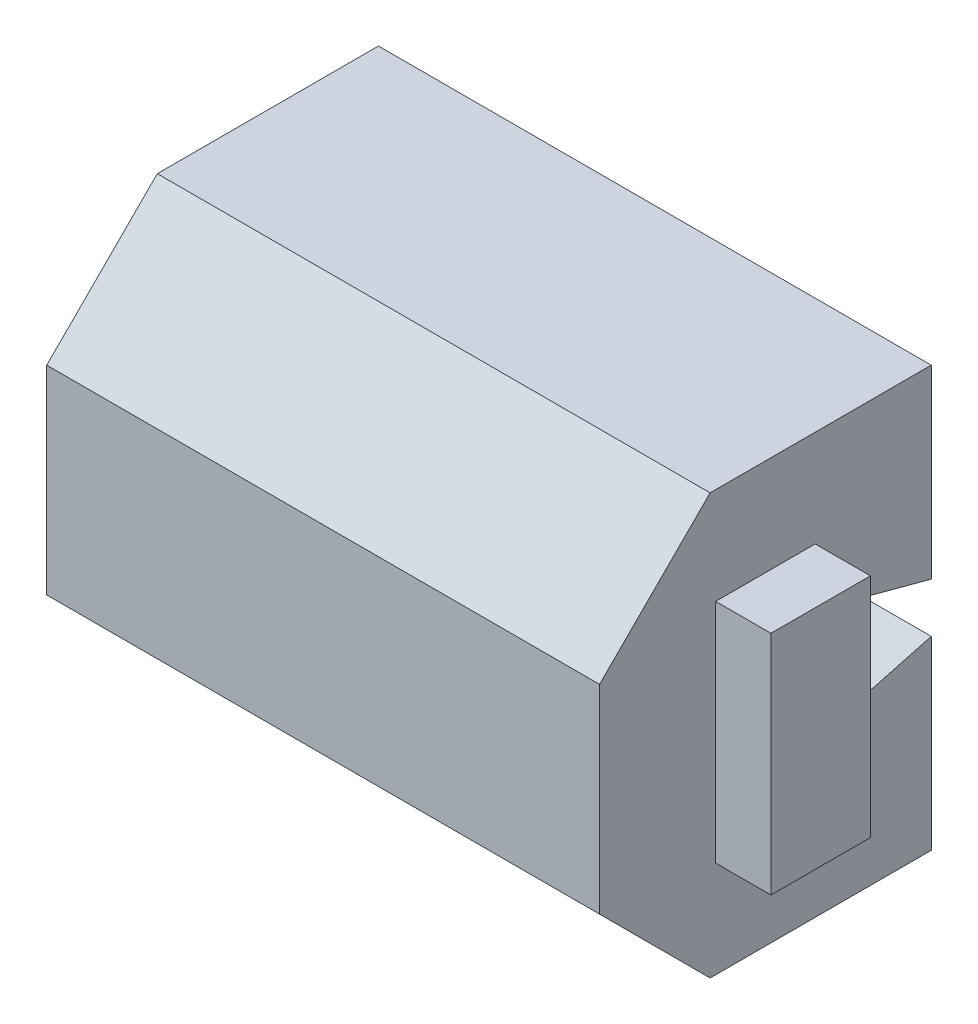
ISO-10303-21;
HEADER;
FILE_DESCRIPTION(('STEP AP214'),'2;1');
FILE_NAME('part.step','',(''),(''),'','','');
FILE_SCHEMA(('AUTOMOTIVE_DESIGN { 1 0 10303 214 1 1 1 1 }'));
ENDSEC;
DATA;
#1=APPLICATION_CONTEXT('core data for automotive mechanical design processes');
#2=APPLICATION_PROTOCOL_DEFINITION('international standard','automotive_design',2000,#1);
#3=PRODUCT_CONTEXT('',#1,'mechanical');
#4=PRODUCT('Part','Part','',(#3));
#5=PRODUCT_RELATED_PRODUCT_CATEGORY('part','',(#4));
#6=PRODUCT_DEFINITION_FORMATION('','',#4);
#7=PRODUCT_DEFINITION_CONTEXT('part definition',#1,'design');
#8=PRODUCT_DEFINITION('design','',#6,#7);
#9=PRODUCT_DEFINITION_SHAPE('','',#8);
#10=(LENGTH_UNIT() NAMED_UNIT(*) SI_UNIT(.MILLI.,.METRE.));
#11=(NAMED_UNIT(*) PLANE_ANGLE_UNIT() SI_UNIT($,.RADIAN.));
#12=(NAMED_UNIT(*) SI_UNIT($,.STERADIAN.) SOLID_ANGLE_UNIT());
#13=UNCERTAINTY_MEASURE_WITH_UNIT(LENGTH_MEASURE(1.E-05),#10,'distance_accuracy_value','');
#14=(GEOMETRIC_REPRESENTATION_CONTEXT(3) GLOBAL_UNCERTAINTY_ASSIGNED_CONTEXT((#13)) GLOBAL_UNIT_ASSIGNED_CONTEXT((#10,
#11,#12)) REPRESENTATION_CONTEXT('',''));
#15=CARTESIAN_POINT('',(0.,0.,0.));
#16=DIRECTION('',(0.,0.,1.));
#17=DIRECTION('',(1.,0.,0.));
#18=AXIS2_PLACEMENT_3D('',#15,#16,#17);
#19=CARTESIAN_POINT('',(-50.,19.,-15.));
#20=DIRECTION('',(0.,0.,1.));
#21=DIRECTION('',(1.,0.,0.));
#22=AXIS2_PLACEMENT_3D('',#19,#20,#21);
#23=PLANE('',#22);
#24=DIRECTION('',(0.,-1.,0.));
#25=VECTOR('',#24,1.);
#26=CARTESIAN_POINT('',(0.,19.,-15.));
#27=LINE('',#26,#25);
#28=CARTESIAN_POINT('',(0.,19.,-15.));
#29=VERTEX_POINT('',#28);
#30=CARTESIAN_POINT('',(0.,2.24038105676654,-15.));
#31=VERTEX_POINT('',#30);
#32=EDGE_CURVE('E208',#29,#31,#27,.T.);
#33=ORIENTED_EDGE('',*,*,#32,.T.);
#34=DIRECTION('',(-1.,0.,0.));
#35=VECTOR('',#34,1.);
#36=CARTESIAN_POINT('',(5.,2.24038105676654,-15.));
#37=LINE('',#36,#35);
#38=CARTESIAN_POINT('',(-50.,2.24038105676654,-15.));
#39=VERTEX_POINT('',#38);
#40=EDGE_CURVE('E181',#31,#39,#37,.T.);
#41=ORIENTED_EDGE('',*,*,#40,.T.);
#42=DIRECTION('',(0.,-1.,0.));
#43=VECTOR('',#42,1.);
#44=CARTESIAN_POINT('',(-50.,19.,-15.));
#45=LINE('',#44,#43);
#46=CARTESIAN_POINT('',(-50.,19.,-15.));
#47=VERTEX_POINT('',#46);
#48=EDGE_CURVE('E215',#47,#39,#45,.T.);
#49=ORIENTED_EDGE('',*,*,#48,.F.);
#50=DIRECTION('',(1.,0.,0.));
#51=VECTOR('',#50,1.);
#52=CARTESIAN_POINT('',(-50.,19.,-15.));
#53=LINE('',#52,#51);
#54=EDGE_CURVE('E235',#47,#29,#53,.T.);
#55=ORIENTED_EDGE('',*,*,#54,.T.);
#56=EDGE_LOOP('',(#33,#41,#49,#55));
#57=FACE_BOUND('',#56,.T.);
#58=ADVANCED_FACE('F47',(#57),#23,.F.);
#59=CARTESIAN_POINT('',(5.,10.25,-4.5));
#60=DIRECTION('',(0.,-1.,0.));
#61=DIRECTION('',(0.,0.,-1.));
#62=AXIS2_PLACEMENT_3D('',#59,#60,#61);
#63=PLANE('',#62);
#64=DIRECTION('',(0.,0.,1.));
#65=VECTOR('',#64,1.);
#66=CARTESIAN_POINT('',(0.,10.25,-4.5));
#67=LINE('',#66,#65);
#68=CARTESIAN_POINT('',(0.,10.25,-4.5));
#69=VERTEX_POINT('',#68);
#70=CARTESIAN_POINT('',(0.,10.25,4.5));
#71=VERTEX_POINT('',#70);
#72=EDGE_CURVE('E239',#69,#71,#67,.T.);
#73=ORIENTED_EDGE('',*,*,#72,.T.);
#74=DIRECTION('',(-1.,0.,0.));
#75=VECTOR('',#74,1.);
#76=CARTESIAN_POINT('',(5.,10.25,4.5));
#77=LINE('',#76,#75);
#78=CARTESIAN_POINT('',(5.,10.25,4.5));
#79=VERTEX_POINT('',#78);
#80=EDGE_CURVE('E280',#79,#71,#77,.T.);
#81=ORIENTED_EDGE('',*,*,#80,.F.);
#82=DIRECTION('',(0.,0.,1.));
#83=VECTOR('',#82,1.);
#84=CARTESIAN_POINT('',(5.,10.25,-4.5));
#85=LINE('',#84,#83);
#86=CARTESIAN_POINT('',(5.,10.25,-4.5));
#87=VERTEX_POINT('',#86);
#88=EDGE_CURVE('E240',#87,#79,#85,.T.);
#89=ORIENTED_EDGE('',*,*,#88,.F.);
#90=DIRECTION('',(-1.,0.,0.));
#91=VECTOR('',#90,1.);
#92=CARTESIAN_POINT('',(5.,10.25,-4.5));
#93=LINE('',#92,#91);
#94=EDGE_CURVE('E254',#87,#69,#93,.T.);
#95=ORIENTED_EDGE('',*,*,#94,.T.);
#96=EDGE_LOOP('',(#73,#81,#89,#95));
#97=FACE_BOUND('',#96,.T.);
#98=ADVANCED_FACE('F349',(#97),#63,.F.);
#99=CARTESIAN_POINT('',(5.,-10.25,4.5));
#100=DIRECTION('',(0.,0.,-1.));
#101=DIRECTION('',(-1.,0.,0.));
#102=AXIS2_PLACEMENT_3D('',#99,#100,#101);
#103=PLANE('',#102);
#104=DIRECTION('',(0.,-1.,0.));
#105=VECTOR('',#104,1.);
#106=CARTESIAN_POINT('',(0.,-10.25,4.5));
#107=LINE('',#106,#105);
#108=CARTESIAN_POINT('',(0.,-10.25,4.5));
#109=VERTEX_POINT('',#108);
#110=EDGE_CURVE('E258',#71,#109,#107,.T.);
#111=ORIENTED_EDGE('',*,*,#110,.T.);
#112=DIRECTION('',(-1.,0.,0.));
#113=VECTOR('',#112,1.);
#114=CARTESIAN_POINT('',(5.,-10.25,4.5));
#115=LINE('',#114,#113);
#116=CARTESIAN_POINT('',(5.,-10.25,4.5));
#117=VERTEX_POINT('',#116);
#118=EDGE_CURVE('E276',#117,#109,#115,.T.);
#119=ORIENTED_EDGE('',*,*,#118,.F.);
#120=DIRECTION('',(0.,-1.,0.));
#121=VECTOR('',#120,1.);
#122=CARTESIAN_POINT('',(5.,-10.25,4.5));
#123=LINE('',#122,#121);
#124=EDGE_CURVE('E244',#79,#117,#123,.T.);
#125=ORIENTED_EDGE('',*,*,#124,.F.);
#126=ORIENTED_EDGE('',*,*,#80,.T.);
#127=EDGE_LOOP('',(#111,#119,#125,#126));
#128=FACE_BOUND('',#127,.T.);
#129=ADVANCED_FACE('F356',(#128),#103,.F.);
#130=CARTESIAN_POINT('',(5.,-10.25,-4.5));
#131=DIRECTION('',(0.,1.,0.));
#132=DIRECTION('',(0.,0.,1.));
#133=AXIS2_PLACEMENT_3D('',#130,#131,#132);
#134=PLANE('',#133);
#135=DIRECTION('',(0.,0.,-1.));
#136=VECTOR('',#135,1.);
#137=CARTESIAN_POINT('',(0.,-10.25,-4.5));
#138=LINE('',#137,#136);
#139=CARTESIAN_POINT('',(0.,-10.25,-4.5));
#140=VERTEX_POINT('',#139);
#141=EDGE_CURVE('E262',#109,#140,#138,.T.);
#142=ORIENTED_EDGE('',*,*,#141,.T.);
#143=DIRECTION('',(-1.,0.,0.));
#144=VECTOR('',#143,1.);
#145=CARTESIAN_POINT('',(5.,-10.25,-4.5));
#146=LINE('',#145,#144);
#147=CARTESIAN_POINT('',(5.,-10.25,-4.5));
#148=VERTEX_POINT('',#147);
#149=EDGE_CURVE('E272',#148,#140,#146,.T.);
#150=ORIENTED_EDGE('',*,*,#149,.F.);
#151=DIRECTION('',(0.,0.,-1.));
#152=VECTOR('',#151,1.);
#153=CARTESIAN_POINT('',(5.,-10.25,-4.5));
#154=LINE('',#153,#152);
#155=EDGE_CURVE('E248',#117,#148,#154,.T.);
#156=ORIENTED_EDGE('',*,*,#155,.F.);
#157=ORIENTED_EDGE('',*,*,#118,.T.);
#158=EDGE_LOOP('',(#142,#150,#156,#157));
#159=FACE_BOUND('',#158,.T.);
#160=ADVANCED_FACE('F381',(#159),#134,.F.);
#161=CARTESIAN_POINT('',(5.,-10.25,-4.5));
#162=DIRECTION('',(0.,0.,1.));
#163=DIRECTION('',(1.,0.,0.));
#164=AXIS2_PLACEMENT_3D('',#161,#162,#163);
#165=PLANE('',#164);
#166=DIRECTION('',(0.,1.,0.));
#167=VECTOR('',#166,1.);
#168=CARTESIAN_POINT('',(0.,-10.25,-4.5));
#169=LINE('',#168,#167);
#170=EDGE_CURVE('E245',#140,#69,#169,.T.);
#171=ORIENTED_EDGE('',*,*,#170,.T.);
#172=ORIENTED_EDGE('',*,*,#94,.F.);
#173=DIRECTION('',(0.,1.,0.));
#174=VECTOR('',#173,1.);
#175=CARTESIAN_POINT('',(5.,-10.25,-4.5));
#176=LINE('',#175,#174);
#177=EDGE_CURVE('E251',#148,#87,#176,.T.);
#178=ORIENTED_EDGE('',*,*,#177,.F.);
#179=ORIENTED_EDGE('',*,*,#149,.T.);
#180=EDGE_LOOP('',(#171,#172,#178,#179));
#181=FACE_BOUND('',#180,.T.);
#182=ADVANCED_FACE('F378',(#181),#165,.F.);
#183=CARTESIAN_POINT('',(5.,0.,0.));
#184=DIRECTION('',(-1.,0.,0.));
#185=DIRECTION('',(0.,0.,1.));
#186=AXIS2_PLACEMENT_3D('',#183,#184,#185);
#187=PLANE('',#186);
#188=ORIENTED_EDGE('',*,*,#88,.T.);
#189=ORIENTED_EDGE('',*,*,#124,.T.);
#190=ORIENTED_EDGE('',*,*,#155,.T.);
#191=ORIENTED_EDGE('',*,*,#177,.T.);
#192=EDGE_LOOP('',(#188,#189,#190,#191));
#193=FACE_BOUND('',#192,.T.);
#194=ADVANCED_FACE('F375',(#193),#187,.F.);
#195=CARTESIAN_POINT('',(0.,0.,0.));
#196=DIRECTION('',(1.,0.,0.));
#197=DIRECTION('',(0.,0.,-1.));
#198=AXIS2_PLACEMENT_3D('',#195,#196,#197);
#199=PLANE('',#198);
#200=DIRECTION('',(0.,0.,-1.));
#201=VECTOR('',#200,1.);
#202=CARTESIAN_POINT('',(0.,19.,-15.));
#203=LINE('',#202,#201);
#204=CARTESIAN_POINT('',(0.,19.,5.00000000000001));
#205=VERTEX_POINT('',#204);
#206=EDGE_CURVE('E225',#205,#29,#203,.T.);
#207=ORIENTED_EDGE('',*,*,#206,.F.);
#208=DIRECTION('',(0.,0.707106781186549,-0.707106781186546));
#209=VECTOR('',#208,1.);
#210=CARTESIAN_POINT('',(0.,12.,12.));
#211=LINE('',#210,#209);
#212=CARTESIAN_POINT('',(0.,8.99999999999998,15.));
#213=VERTEX_POINT('',#212);
#214=EDGE_CURVE('E291',#205,#213,#211,.F.);
#215=ORIENTED_EDGE('',*,*,#214,.T.);
#216=DIRECTION('',(0.,1.,0.));
#217=VECTOR('',#216,1.);
#218=CARTESIAN_POINT('',(0.,19.,15.));
#219=LINE('',#218,#217);
#220=CARTESIAN_POINT('',(0.,-9.,15.));
#221=VERTEX_POINT('',#220);
#222=EDGE_CURVE('E222',#221,#213,#219,.T.);
#223=ORIENTED_EDGE('',*,*,#222,.F.);
#224=DIRECTION('',(0.,0.707106781186546,0.707106781186549));
#225=VECTOR('',#224,1.);
#226=CARTESIAN_POINT('',(0.,-12.,12.));
#227=LINE('',#226,#225);
#228=CARTESIAN_POINT('',(0.,-19.,4.99999999999996));
#229=VERTEX_POINT('',#228);
#230=EDGE_CURVE('E288',#221,#229,#227,.F.);
#231=ORIENTED_EDGE('',*,*,#230,.T.);
#232=DIRECTION('',(0.,0.,1.));
#233=VECTOR('',#232,1.);
#234=CARTESIAN_POINT('',(0.,-19.,-15.));
#235=LINE('',#234,#233);
#236=CARTESIAN_POINT('',(0.,-19.,-15.));
#237=VERTEX_POINT('',#236);
#238=EDGE_CURVE('E203',#237,#229,#235,.T.);
#239=ORIENTED_EDGE('',*,*,#238,.F.);
#240=CARTESIAN_POINT('',(0.,-2.24038105676655,-15.));
#241=VERTEX_POINT('',#240);
#242=EDGE_CURVE('E228',#241,#237,#27,.T.);
#243=ORIENTED_EDGE('',*,*,#242,.F.);
#244=DIRECTION('',(0.,0.258819045102525,-0.965925826289067));
#245=VECTOR('',#244,1.);
#246=CARTESIAN_POINT('',(0.,-5.84030398304195,-1.56490473580839));
#247=LINE('',#246,#245);
#248=CARTESIAN_POINT('',(0.,-4.25,-7.5));
#249=VERTEX_POINT('',#248);
#250=EDGE_CURVE('E185',#249,#241,#247,.T.);
#251=ORIENTED_EDGE('',*,*,#250,.F.);
#252=DIRECTION('',(0.,-1.,0.));
#253=VECTOR('',#252,1.);
#254=CARTESIAN_POINT('',(0.,0.,-7.5));
#255=LINE('',#254,#253);
#256=CARTESIAN_POINT('',(0.,4.25,-7.5));
#257=VERTEX_POINT('',#256);
#258=EDGE_CURVE('E197',#257,#249,#255,.T.);
#259=ORIENTED_EDGE('',*,*,#258,.F.);
#260=DIRECTION('',(0.,0.258819045102525,0.965925826289067));
#261=VECTOR('',#260,1.);
#262=CARTESIAN_POINT('',(0.,5.84030398304195,-1.56490473580839));
#263=LINE('',#262,#261);
#264=EDGE_CURVE('E200',#31,#257,#263,.T.);
#265=ORIENTED_EDGE('',*,*,#264,.F.);
#266=ORIENTED_EDGE('',*,*,#32,.F.);
#267=EDGE_LOOP('',(#207,#215,#223,#231,#239,#243,#251,#259,#265,#266));
#268=FACE_BOUND('',#267,.T.);
#269=ORIENTED_EDGE('',*,*,#72,.F.);
#270=ORIENTED_EDGE('',*,*,#170,.F.);
#271=ORIENTED_EDGE('',*,*,#141,.F.);
#272=ORIENTED_EDGE('',*,*,#110,.F.);
#273=EDGE_LOOP('',(#269,#270,#271,#272));
#274=FACE_BOUND('',#273,.T.);
#275=ADVANCED_FACE('F317',(#268,#274),#199,.T.);
#276=CARTESIAN_POINT('',(-50.,-19.,-15.));
#277=DIRECTION('',(0.,1.,0.));
#278=DIRECTION('',(0.,0.,1.));
#279=AXIS2_PLACEMENT_3D('',#276,#277,#278);
#280=PLANE('',#279);
#281=ORIENTED_EDGE('',*,*,#238,.T.);
#282=DIRECTION('',(-1.,0.,0.));
#283=VECTOR('',#282,1.);
#284=CARTESIAN_POINT('',(-50.,-19.,4.99999999999996));
#285=LINE('',#284,#283);
#286=CARTESIAN_POINT('',(-50.,-19.,4.99999999999996));
#287=VERTEX_POINT('',#286);
#288=EDGE_CURVE('E11',#229,#287,#285,.T.);
#289=ORIENTED_EDGE('',*,*,#288,.T.);
#290=DIRECTION('',(0.,0.,1.));
#291=VECTOR('',#290,1.);
#292=CARTESIAN_POINT('',(-50.,-19.,-15.));
#293=LINE('',#292,#291);
#294=CARTESIAN_POINT('',(-50.,-19.,-15.));
#295=VERTEX_POINT('',#294);
#296=EDGE_CURVE('E204',#295,#287,#293,.T.);
#297=ORIENTED_EDGE('',*,*,#296,.F.);
#298=DIRECTION('',(1.,0.,0.));
#299=VECTOR('',#298,1.);
#300=CARTESIAN_POINT('',(-50.,-19.,-15.));
#301=LINE('',#300,#299);
#302=EDGE_CURVE('E219',#295,#237,#301,.T.);
#303=ORIENTED_EDGE('',*,*,#302,.T.);
#304=EDGE_LOOP('',(#281,#289,#297,#303));
#305=FACE_BOUND('',#304,.T.);
#306=ADVANCED_FACE('F326',(#305),#280,.F.);
#307=CARTESIAN_POINT('',(-50.,19.,15.));
#308=DIRECTION('',(0.,0.,-1.));
#309=DIRECTION('',(-1.,0.,0.));
#310=AXIS2_PLACEMENT_3D('',#307,#308,#309);
#311=PLANE('',#310);
#312=ORIENTED_EDGE('',*,*,#222,.T.);
#313=DIRECTION('',(-1.,0.,0.));
#314=VECTOR('',#313,1.);
#315=CARTESIAN_POINT('',(-50.,8.99999999999998,15.));
#316=LINE('',#315,#314);
#317=CARTESIAN_POINT('',(-50.,8.99999999999998,15.));
#318=VERTEX_POINT('',#317);
#319=EDGE_CURVE('E70',#213,#318,#316,.T.);
#320=ORIENTED_EDGE('',*,*,#319,.T.);
#321=DIRECTION('',(0.,1.,0.));
#322=VECTOR('',#321,1.);
#323=CARTESIAN_POINT('',(-50.,19.,15.));
#324=LINE('',#323,#322);
#325=CARTESIAN_POINT('',(-50.,-9.,15.));
#326=VERTEX_POINT('',#325);
#327=EDGE_CURVE('E207',#326,#318,#324,.T.);
#328=ORIENTED_EDGE('',*,*,#327,.F.);
#329=DIRECTION('',(1.,0.,0.));
#330=VECTOR('',#329,1.);
#331=CARTESIAN_POINT('',(-50.,-9.,15.));
#332=LINE('',#331,#330);
#333=EDGE_CURVE('E294',#326,#221,#332,.T.);
#334=ORIENTED_EDGE('',*,*,#333,.T.);
#335=EDGE_LOOP('',(#312,#320,#328,#334));
#336=FACE_BOUND('',#335,.T.);
#337=ADVANCED_FACE('F320',(#336),#311,.F.);
#338=CARTESIAN_POINT('',(-50.,19.,-15.));
#339=DIRECTION('',(0.,-1.,0.));
#340=DIRECTION('',(0.,0.,-1.));
#341=AXIS2_PLACEMENT_3D('',#338,#339,#340);
#342=PLANE('',#341);
#343=DIRECTION('',(0.,0.,-1.));
#344=VECTOR('',#343,1.);
#345=CARTESIAN_POINT('',(-50.,19.,-15.));
#346=LINE('',#345,#344);
#347=CARTESIAN_POINT('',(-50.,19.,5.00000000000001));
#348=VERTEX_POINT('',#347);
#349=EDGE_CURVE('E211',#348,#47,#346,.T.);
#350=ORIENTED_EDGE('',*,*,#349,.F.);
#351=DIRECTION('',(1.,0.,0.));
#352=VECTOR('',#351,1.);
#353=CARTESIAN_POINT('',(-50.,19.,5.00000000000001));
#354=LINE('',#353,#352);
#355=EDGE_CURVE('E284',#348,#205,#354,.T.);
#356=ORIENTED_EDGE('',*,*,#355,.T.);
#357=ORIENTED_EDGE('',*,*,#206,.T.);
#358=ORIENTED_EDGE('',*,*,#54,.F.);
#359=EDGE_LOOP('',(#350,#356,#357,#358));
#360=FACE_BOUND('',#359,.T.);
#361=ADVANCED_FACE('F311',(#360),#342,.F.);
#362=CARTESIAN_POINT('',(-50.,-2.24038105676655,-15.));
#363=VERTEX_POINT('',#362);
#364=EDGE_CURVE('E214',#363,#295,#45,.T.);
#365=ORIENTED_EDGE('',*,*,#364,.F.);
#366=DIRECTION('',(-1.,0.,0.));
#367=VECTOR('',#366,1.);
#368=CARTESIAN_POINT('',(5.,-2.24038105676655,-15.));
#369=LINE('',#368,#367);
#370=EDGE_CURVE('E189',#241,#363,#369,.T.);
#371=ORIENTED_EDGE('',*,*,#370,.F.);
#372=ORIENTED_EDGE('',*,*,#242,.T.);
#373=ORIENTED_EDGE('',*,*,#302,.F.);
#374=EDGE_LOOP('',(#365,#371,#372,#373));
#375=FACE_BOUND('',#374,.T.);
#376=ADVANCED_FACE('F330',(#375),#23,.F.);
#377=CARTESIAN_POINT('',(-50.,0.,0.));
#378=DIRECTION('',(1.,0.,0.));
#379=DIRECTION('',(0.,0.,-1.));
#380=AXIS2_PLACEMENT_3D('',#377,#378,#379);
#381=PLANE('',#380);
#382=CARTESIAN_POINT('',(-50.,0.,0.));
#383=DIRECTION('',(-1.,0.,0.));
#384=DIRECTION('',(0.,0.,1.));
#385=AXIS2_PLACEMENT_3D('',#382,#383,#384);
#386=CIRCLE('',#385,5.);
#387=CARTESIAN_POINT('',(-50.,0.,4.99999999999999));
#388=VERTEX_POINT('',#387);
#389=EDGE_CURVE('E165',#388,#388,#386,.T.);
#390=ORIENTED_EDGE('',*,*,#389,.F.);
#391=EDGE_LOOP('',(#390));
#392=FACE_BOUND('',#391,.T.);
#393=ORIENTED_EDGE('',*,*,#327,.T.);
#394=DIRECTION('',(0.,-0.707106781186549,0.707106781186546));
#395=VECTOR('',#394,1.);
#396=CARTESIAN_POINT('',(-50.,19.,5.00000000000001));
#397=LINE('',#396,#395);
#398=EDGE_CURVE('E57',#318,#348,#397,.F.);
#399=ORIENTED_EDGE('',*,*,#398,.T.);
#400=ORIENTED_EDGE('',*,*,#349,.T.);
#401=ORIENTED_EDGE('',*,*,#48,.T.);
#402=DIRECTION('',(0.,-0.258819045102525,-0.965925826289067));
#403=VECTOR('',#402,1.);
#404=CARTESIAN_POINT('',(-50.,2.24038105676654,-15.));
#405=LINE('',#404,#403);
#406=CARTESIAN_POINT('',(-50.,4.25,-7.5));
#407=VERTEX_POINT('',#406);
#408=EDGE_CURVE('E164',#407,#39,#405,.T.);
#409=ORIENTED_EDGE('',*,*,#408,.F.);
#410=DIRECTION('',(0.,1.,0.));
#411=VECTOR('',#410,1.);
#412=CARTESIAN_POINT('',(-50.,-4.25,-7.5));
#413=LINE('',#412,#411);
#414=CARTESIAN_POINT('',(-50.,-4.25,-7.5));
#415=VERTEX_POINT('',#414);
#416=EDGE_CURVE('E177',#415,#407,#413,.T.);
#417=ORIENTED_EDGE('',*,*,#416,.F.);
#418=DIRECTION('',(0.,-0.258819045102525,0.965925826289067));
#419=VECTOR('',#418,1.);
#420=CARTESIAN_POINT('',(-50.,-2.24038105676655,-15.));
#421=LINE('',#420,#419);
#422=EDGE_CURVE('E169',#363,#415,#421,.T.);
#423=ORIENTED_EDGE('',*,*,#422,.F.);
#424=ORIENTED_EDGE('',*,*,#364,.T.);
#425=ORIENTED_EDGE('',*,*,#296,.T.);
#426=DIRECTION('',(0.,-0.707106781186546,-0.707106781186549));
#427=VECTOR('',#426,1.);
#428=CARTESIAN_POINT('',(-50.,-9.,15.));
#429=LINE('',#428,#427);
#430=EDGE_CURVE('E300',#287,#326,#429,.F.);
#431=ORIENTED_EDGE('',*,*,#430,.T.);
#432=EDGE_LOOP('',(#393,#399,#400,#401,#409,#417,#423,#424,#425,#431));
#433=FACE_BOUND('',#432,.T.);
#434=ADVANCED_FACE('F306',(#392,#433),#381,.F.);
#435=CARTESIAN_POINT('',(5.,2.24038105676654,-15.));
#436=DIRECTION('',(0.,0.965925826289067,-0.258819045102525));
#437=DIRECTION('',(0.,0.258819045102525,0.965925826289067));
#438=AXIS2_PLACEMENT_3D('',#435,#436,#437);
#439=PLANE('',#438);
#440=ORIENTED_EDGE('',*,*,#264,.T.);
#441=DIRECTION('',(-1.,0.,0.));
#442=VECTOR('',#441,1.);
#443=CARTESIAN_POINT('',(5.,4.25,-7.5));
#444=LINE('',#443,#442);
#445=EDGE_CURVE('E182',#257,#407,#444,.T.);
#446=ORIENTED_EDGE('',*,*,#445,.T.);
#447=ORIENTED_EDGE('',*,*,#408,.T.);
#448=ORIENTED_EDGE('',*,*,#40,.F.);
#449=EDGE_LOOP('',(#440,#446,#447,#448));
#450=FACE_BOUND('',#449,.T.);
#451=ADVANCED_FACE('F346',(#450),#439,.F.);
#452=CARTESIAN_POINT('',(5.,-4.25,-7.5));
#453=DIRECTION('',(0.,0.,1.));
#454=DIRECTION('',(0.,-1.,0.));
#455=AXIS2_PLACEMENT_3D('',#452,#453,#454);
#456=PLANE('',#455);
#457=ORIENTED_EDGE('',*,*,#258,.T.);
#458=DIRECTION('',(-1.,0.,0.));
#459=VECTOR('',#458,1.);
#460=CARTESIAN_POINT('',(5.,-4.25,-7.5));
#461=LINE('',#460,#459);
#462=EDGE_CURVE('E186',#249,#415,#461,.T.);
#463=ORIENTED_EDGE('',*,*,#462,.T.);
#464=ORIENTED_EDGE('',*,*,#416,.T.);
#465=ORIENTED_EDGE('',*,*,#445,.F.);
#466=EDGE_LOOP('',(#457,#463,#464,#465));
#467=FACE_BOUND('',#466,.T.);
#468=ADVANCED_FACE('F344',(#467),#456,.F.);
#469=CARTESIAN_POINT('',(5.,-2.24038105676655,-15.));
#470=DIRECTION('',(0.,-0.965925826289067,-0.258819045102525));
#471=DIRECTION('',(0.,0.258819045102525,-0.965925826289067));
#472=AXIS2_PLACEMENT_3D('',#469,#470,#471);
#473=PLANE('',#472);
#474=ORIENTED_EDGE('',*,*,#250,.T.);
#475=ORIENTED_EDGE('',*,*,#370,.T.);
#476=ORIENTED_EDGE('',*,*,#422,.T.);
#477=ORIENTED_EDGE('',*,*,#462,.F.);
#478=EDGE_LOOP('',(#474,#475,#476,#477));
#479=FACE_BOUND('',#478,.T.);
#480=ADVANCED_FACE('F157',(#479),#473,.F.);
#481=CARTESIAN_POINT('',(-10.,0.,0.));
#482=DIRECTION('',(-1.,0.,0.));
#483=DIRECTION('',(0.,0.,1.));
#484=AXIS2_PLACEMENT_3D('',#481,#482,#483);
#485=CONICAL_SURFACE('',#484,4.99999999999999,1.02974425867665);
#486=CARTESIAN_POINT('',(-6.9956969048622,0.,0.));
#487=VERTEX_POINT('',#486);
#488=VERTEX_LOOP('',#487);
#489=FACE_BOUND('',#488,.T.);
#490=CARTESIAN_POINT('',(-10.,0.,0.));
#491=DIRECTION('',(-1.,0.,0.));
#492=DIRECTION('',(0.,0.,1.));
#493=AXIS2_PLACEMENT_3D('',#490,#491,#492);
#494=CIRCLE('',#493,4.99999999999999);
#495=CARTESIAN_POINT('',(-10.,0.,4.99999999999999));
#496=VERTEX_POINT('',#495);
#497=EDGE_CURVE('E161',#496,#496,#494,.T.);
#498=ORIENTED_EDGE('',*,*,#497,.T.);
#499=EDGE_LOOP('',(#498));
#500=FACE_BOUND('',#499,.T.);
#501=ADVANCED_FACE('F153',(#489,#500),#485,.F.);
#502=CARTESIAN_POINT('',(-50.,0.,0.));
#503=DIRECTION('',(-1.,0.,0.));
#504=DIRECTION('',(0.,0.,1.));
#505=AXIS2_PLACEMENT_3D('',#502,#503,#504);
#506=CYLINDRICAL_SURFACE('',#505,4.99999999999999);
#507=ORIENTED_EDGE('',*,*,#497,.F.);
#508=EDGE_LOOP('',(#507));
#509=FACE_BOUND('',#508,.T.);
#510=ORIENTED_EDGE('',*,*,#389,.T.);
#511=EDGE_LOOP('',(#510));
#512=FACE_BOUND('',#511,.T.);
#513=ADVANCED_FACE('F156',(#509,#512),#506,.F.);
#514=CARTESIAN_POINT('',(-50.,19.,5.00000000000001));
#515=DIRECTION('',(0.,-0.707106781186546,-0.707106781186549));
#516=DIRECTION('',(1.,0.,0.));
#517=AXIS2_PLACEMENT_3D('',#514,#515,#516);
#518=PLANE('',#517);
#519=ORIENTED_EDGE('',*,*,#398,.F.);
#520=ORIENTED_EDGE('',*,*,#319,.F.);
#521=ORIENTED_EDGE('',*,*,#214,.F.);
#522=ORIENTED_EDGE('',*,*,#355,.F.);
#523=EDGE_LOOP('',(#519,#520,#521,#522));
#524=FACE_BOUND('',#523,.T.);
#525=ADVANCED_FACE('F314',(#524),#518,.F.);
#526=CARTESIAN_POINT('',(-50.,-9.,15.));
#527=DIRECTION('',(0.,0.707106781186549,-0.707106781186546));
#528=DIRECTION('',(1.,0.,0.));
#529=AXIS2_PLACEMENT_3D('',#526,#527,#528);
#530=PLANE('',#529);
#531=ORIENTED_EDGE('',*,*,#430,.F.);
#532=ORIENTED_EDGE('',*,*,#288,.F.);
#533=ORIENTED_EDGE('',*,*,#230,.F.);
#534=ORIENTED_EDGE('',*,*,#333,.F.);
#535=EDGE_LOOP('',(#531,#532,#533,#534));
#536=FACE_BOUND('',#535,.T.);
#537=ADVANCED_FACE('F50',(#536),#530,.F.);
#538=CLOSED_SHELL('',(#58,#98,#129,#160,#182,#194,#275,#306,#337,#361,#376,#434,#451,#468,#480,
#501,#513,#525,#537));
#539=MANIFOLD_SOLID_BREP('B2',#538);
#540=ADVANCED_BREP_SHAPE_REPRESENTATION('',(#18,#539),#14);
#541=SHAPE_DEFINITION_REPRESENTATION(#9,#540);
ENDSEC;
END-ISO-10303-21;
